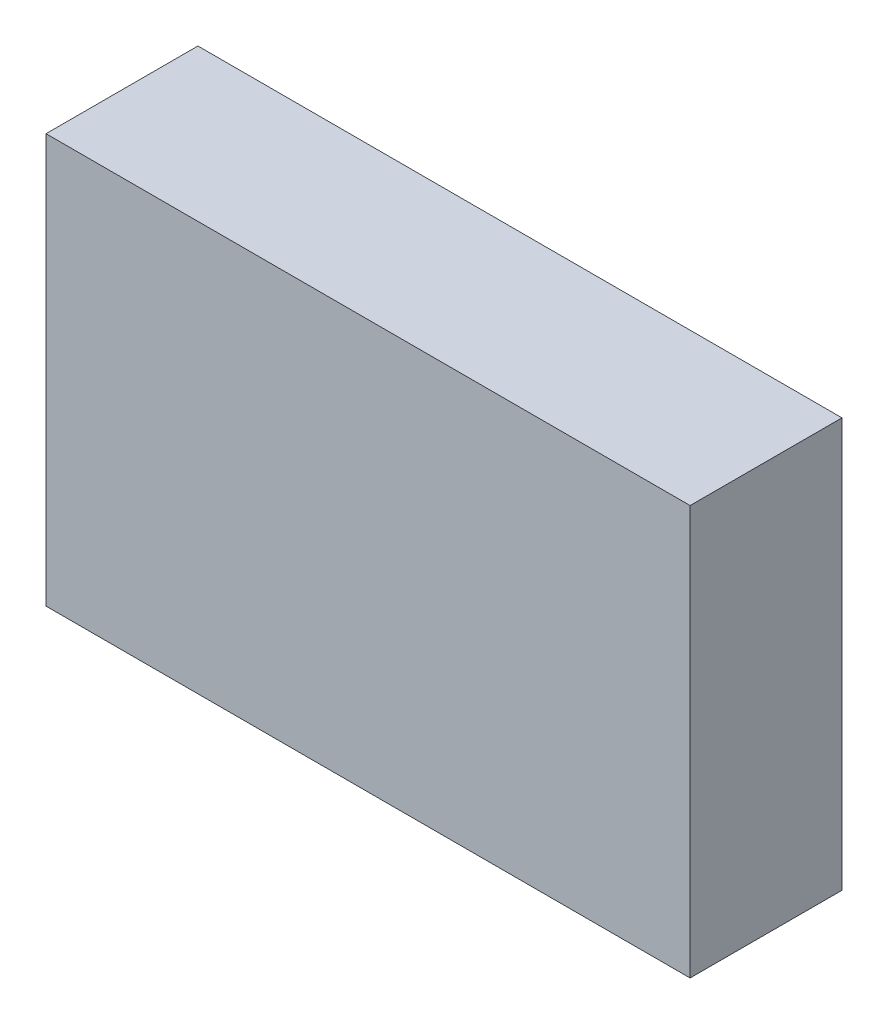
ISO-10303-21;
HEADER;
FILE_DESCRIPTION(('STEP AP214'),'2;1');
FILE_NAME('part.step','',(''),(''),'','','');
FILE_SCHEMA(('AUTOMOTIVE_DESIGN { 1 0 10303 214 1 1 1 1 }'));
ENDSEC;
DATA;
#1=APPLICATION_CONTEXT('core data for automotive mechanical design processes');
#2=APPLICATION_PROTOCOL_DEFINITION('international standard','automotive_design',2000,#1);
#3=PRODUCT_CONTEXT('',#1,'mechanical');
#4=PRODUCT('Part','Part','',(#3));
#5=PRODUCT_RELATED_PRODUCT_CATEGORY('part','',(#4));
#6=PRODUCT_DEFINITION_FORMATION('','',#4);
#7=PRODUCT_DEFINITION_CONTEXT('part definition',#1,'design');
#8=PRODUCT_DEFINITION('design','',#6,#7);
#9=PRODUCT_DEFINITION_SHAPE('','',#8);
#10=(LENGTH_UNIT() NAMED_UNIT(*) SI_UNIT(.MILLI.,.METRE.));
#11=(NAMED_UNIT(*) PLANE_ANGLE_UNIT() SI_UNIT($,.RADIAN.));
#12=(NAMED_UNIT(*) SI_UNIT($,.STERADIAN.) SOLID_ANGLE_UNIT());
#13=UNCERTAINTY_MEASURE_WITH_UNIT(LENGTH_MEASURE(1.E-05),#10,'distance_accuracy_value','');
#14=(GEOMETRIC_REPRESENTATION_CONTEXT(3) GLOBAL_UNCERTAINTY_ASSIGNED_CONTEXT((#13)) GLOBAL_UNIT_ASSIGNED_CONTEXT((#10,
#11,#12)) REPRESENTATION_CONTEXT('',''));
#15=CARTESIAN_POINT('',(0.,0.,0.));
#16=DIRECTION('',(0.,0.,1.));
#17=DIRECTION('',(1.,0.,0.));
#18=AXIS2_PLACEMENT_3D('',#15,#16,#17);
#19=CARTESIAN_POINT('',(-18.959117162523,14.2193378718923,10.));
#20=DIRECTION('',(1.,0.,0.));
#21=DIRECTION('',(0.,0.,-1.));
#22=AXIS2_PLACEMENT_3D('',#19,#20,#21);
#23=PLANE('',#22);
#24=DIRECTION('',(0.,-1.,0.));
#25=VECTOR('',#24,1.);
#26=CARTESIAN_POINT('',(-18.959117162523,14.2193378718923,0.));
#27=LINE('',#26,#25);
#28=CARTESIAN_POINT('',(-18.959117162523,14.2193378718923,0.));
#29=VERTEX_POINT('',#28);
#30=CARTESIAN_POINT('',(-18.959117162523,-12.7225654643247,0.));
#31=VERTEX_POINT('',#30);
#32=EDGE_CURVE('E104',#29,#31,#27,.T.);
#33=ORIENTED_EDGE('',*,*,#32,.T.);
#34=DIRECTION('',(0.,0.,-1.));
#35=VECTOR('',#34,1.);
#36=CARTESIAN_POINT('',(-18.959117162523,-12.7225654643247,10.));
#37=LINE('',#36,#35);
#38=CARTESIAN_POINT('',(-18.959117162523,-12.7225654643247,10.));
#39=VERTEX_POINT('',#38);
#40=EDGE_CURVE('E11',#39,#31,#37,.T.);
#41=ORIENTED_EDGE('',*,*,#40,.F.);
#42=DIRECTION('',(0.,-1.,0.));
#43=VECTOR('',#42,1.);
#44=CARTESIAN_POINT('',(-18.959117162523,14.2193378718923,10.));
#45=LINE('',#44,#43);
#46=CARTESIAN_POINT('',(-18.959117162523,14.2193378718923,10.));
#47=VERTEX_POINT('',#46);
#48=EDGE_CURVE('E90',#47,#39,#45,.T.);
#49=ORIENTED_EDGE('',*,*,#48,.F.);
#50=DIRECTION('',(0.,0.,-1.));
#51=VECTOR('',#50,1.);
#52=CARTESIAN_POINT('',(-18.959117162523,14.2193378718923,10.));
#53=LINE('',#52,#51);
#54=EDGE_CURVE('E57',#47,#29,#53,.T.);
#55=ORIENTED_EDGE('',*,*,#54,.T.);
#56=EDGE_LOOP('',(#33,#41,#49,#55));
#57=FACE_BOUND('',#56,.T.);
#58=ADVANCED_FACE('F41',(#57),#23,.F.);
#59=CARTESIAN_POINT('',(-18.959117162523,-12.7225654643247,10.));
#60=DIRECTION('',(0.,1.,0.));
#61=DIRECTION('',(0.,0.,1.));
#62=AXIS2_PLACEMENT_3D('',#59,#60,#61);
#63=PLANE('',#62);
#64=DIRECTION('',(1.,0.,0.));
#65=VECTOR('',#64,1.);
#66=CARTESIAN_POINT('',(-18.959117162523,-12.7225654643247,0.));
#67=LINE('',#66,#65);
#68=CARTESIAN_POINT('',(23.4494343852258,-12.7225654643247,0.));
#69=VERTEX_POINT('',#68);
#70=EDGE_CURVE('E95',#31,#69,#67,.T.);
#71=ORIENTED_EDGE('',*,*,#70,.T.);
#72=DIRECTION('',(0.,0.,-1.));
#73=VECTOR('',#72,1.);
#74=CARTESIAN_POINT('',(23.4494343852258,-12.7225654643247,10.));
#75=LINE('',#74,#73);
#76=CARTESIAN_POINT('',(23.4494343852258,-12.7225654643247,10.));
#77=VERTEX_POINT('',#76);
#78=EDGE_CURVE('E49',#77,#69,#75,.T.);
#79=ORIENTED_EDGE('',*,*,#78,.F.);
#80=DIRECTION('',(1.,0.,0.));
#81=VECTOR('',#80,1.);
#82=CARTESIAN_POINT('',(-18.959117162523,-12.7225654643247,10.));
#83=LINE('',#82,#81);
#84=EDGE_CURVE('E82',#39,#77,#83,.T.);
#85=ORIENTED_EDGE('',*,*,#84,.F.);
#86=ORIENTED_EDGE('',*,*,#40,.T.);
#87=EDGE_LOOP('',(#71,#79,#85,#86));
#88=FACE_BOUND('',#87,.T.);
#89=ADVANCED_FACE('F94',(#88),#63,.F.);
#90=CARTESIAN_POINT('',(23.4494343852258,14.2193378718923,10.));
#91=DIRECTION('',(1.,0.,0.));
#92=DIRECTION('',(0.,0.,-1.));
#93=AXIS2_PLACEMENT_3D('',#90,#91,#92);
#94=PLANE('',#93);
#95=DIRECTION('',(0.,-1.,0.));
#96=VECTOR('',#95,1.);
#97=CARTESIAN_POINT('',(23.4494343852258,14.2193378718923,0.));
#98=LINE('',#97,#96);
#99=CARTESIAN_POINT('',(23.4494343852258,14.2193378718923,0.));
#100=VERTEX_POINT('',#99);
#101=EDGE_CURVE('E107',#100,#69,#98,.T.);
#102=ORIENTED_EDGE('',*,*,#101,.F.);
#103=DIRECTION('',(0.,0.,-1.));
#104=VECTOR('',#103,1.);
#105=CARTESIAN_POINT('',(23.4494343852258,14.2193378718923,10.));
#106=LINE('',#105,#104);
#107=CARTESIAN_POINT('',(23.4494343852258,14.2193378718923,10.));
#108=VERTEX_POINT('',#107);
#109=EDGE_CURVE('E71',#108,#100,#106,.T.);
#110=ORIENTED_EDGE('',*,*,#109,.F.);
#111=DIRECTION('',(0.,-1.,0.));
#112=VECTOR('',#111,1.);
#113=CARTESIAN_POINT('',(23.4494343852258,14.2193378718923,10.));
#114=LINE('',#113,#112);
#115=EDGE_CURVE('E89',#108,#77,#114,.T.);
#116=ORIENTED_EDGE('',*,*,#115,.T.);
#117=ORIENTED_EDGE('',*,*,#78,.T.);
#118=EDGE_LOOP('',(#102,#110,#116,#117));
#119=FACE_BOUND('',#118,.T.);
#120=ADVANCED_FACE('F98',(#119),#94,.T.);
#121=CARTESIAN_POINT('',(-18.959117162523,14.2193378718923,10.));
#122=DIRECTION('',(0.,1.,0.));
#123=DIRECTION('',(0.,0.,1.));
#124=AXIS2_PLACEMENT_3D('',#121,#122,#123);
#125=PLANE('',#124);
#126=DIRECTION('',(1.,0.,0.));
#127=VECTOR('',#126,1.);
#128=CARTESIAN_POINT('',(-18.959117162523,14.2193378718923,0.));
#129=LINE('',#128,#127);
#130=EDGE_CURVE('E109',#29,#100,#129,.T.);
#131=ORIENTED_EDGE('',*,*,#130,.F.);
#132=ORIENTED_EDGE('',*,*,#54,.F.);
#133=DIRECTION('',(1.,0.,0.));
#134=VECTOR('',#133,1.);
#135=CARTESIAN_POINT('',(-18.959117162523,14.2193378718923,10.));
#136=LINE('',#135,#134);
#137=EDGE_CURVE('E99',#47,#108,#136,.T.);
#138=ORIENTED_EDGE('',*,*,#137,.T.);
#139=ORIENTED_EDGE('',*,*,#109,.T.);
#140=EDGE_LOOP('',(#131,#132,#138,#139));
#141=FACE_BOUND('',#140,.T.);
#142=ADVANCED_FACE('F115',(#141),#125,.T.);
#143=CARTESIAN_POINT('',(0.,0.,10.));
#144=DIRECTION('',(0.,0.,1.));
#145=DIRECTION('',(1.,0.,0.));
#146=AXIS2_PLACEMENT_3D('',#143,#144,#145);
#147=PLANE('',#146);
#148=ORIENTED_EDGE('',*,*,#48,.T.);
#149=ORIENTED_EDGE('',*,*,#84,.T.);
#150=ORIENTED_EDGE('',*,*,#115,.F.);
#151=ORIENTED_EDGE('',*,*,#137,.F.);
#152=EDGE_LOOP('',(#148,#149,#150,#151));
#153=FACE_BOUND('',#152,.T.);
#154=ADVANCED_FACE('F86',(#153),#147,.T.);
#155=CARTESIAN_POINT('',(0.,0.,0.));
#156=DIRECTION('',(0.,0.,1.));
#157=DIRECTION('',(1.,0.,0.));
#158=AXIS2_PLACEMENT_3D('',#155,#156,#157);
#159=PLANE('',#158);
#160=ORIENTED_EDGE('',*,*,#32,.F.);
#161=ORIENTED_EDGE('',*,*,#130,.T.);
#162=ORIENTED_EDGE('',*,*,#101,.T.);
#163=ORIENTED_EDGE('',*,*,#70,.F.);
#164=EDGE_LOOP('',(#160,#161,#162,#163));
#165=FACE_BOUND('',#164,.T.);
#166=ADVANCED_FACE('F114',(#165),#159,.F.);
#167=CLOSED_SHELL('',(#58,#89,#120,#142,#154,#166));
#168=MANIFOLD_SOLID_BREP('B2',#167);
#169=ADVANCED_BREP_SHAPE_REPRESENTATION('',(#18,#168),#14);
#170=SHAPE_DEFINITION_REPRESENTATION(#9,#169);
ENDSEC;
END-ISO-10303-21;
